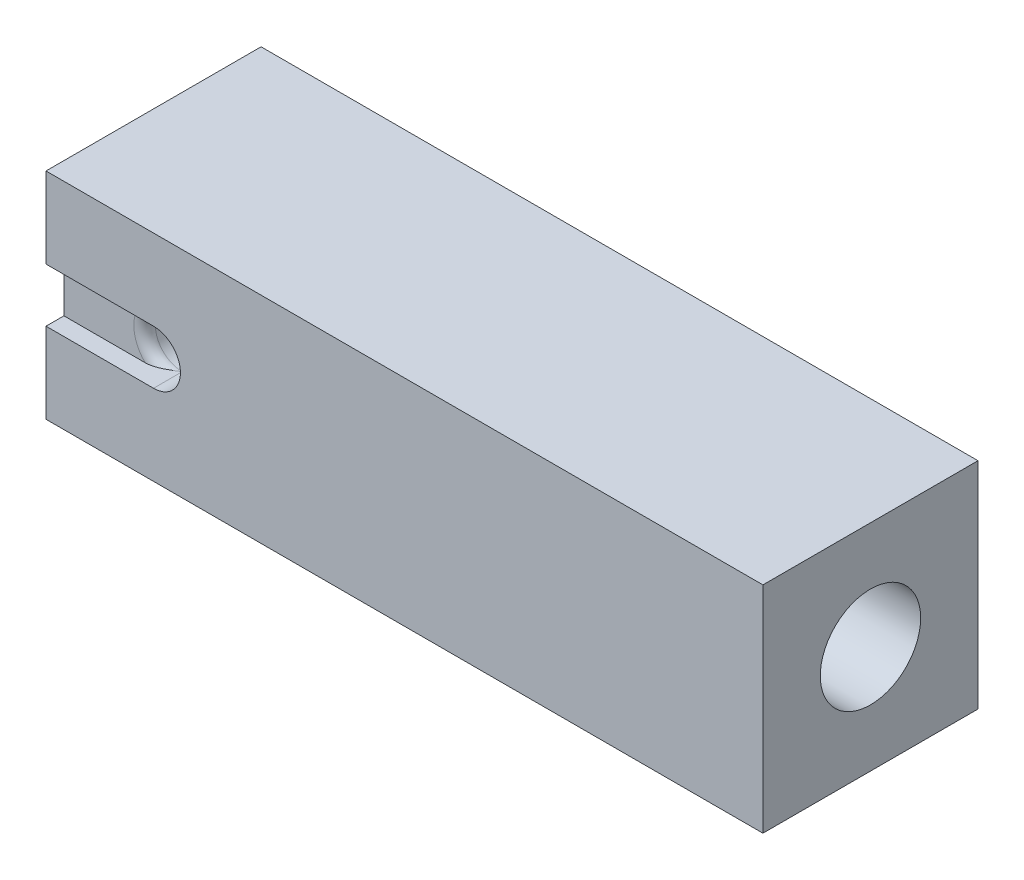
ISO-10303-21;
HEADER;
FILE_DESCRIPTION(('STEP AP214'),'2;1');
FILE_NAME('part.step','',(''),(''),'','','');
FILE_SCHEMA(('AUTOMOTIVE_DESIGN { 1 0 10303 214 1 1 1 1 }'));
ENDSEC;
DATA;
#1=APPLICATION_CONTEXT('core data for automotive mechanical design processes');
#2=APPLICATION_PROTOCOL_DEFINITION('international standard','automotive_design',2000,#1);
#3=PRODUCT_CONTEXT('',#1,'mechanical');
#4=PRODUCT('Part','Part','',(#3));
#5=PRODUCT_RELATED_PRODUCT_CATEGORY('part','',(#4));
#6=PRODUCT_DEFINITION_FORMATION('','',#4);
#7=PRODUCT_DEFINITION_CONTEXT('part definition',#1,'design');
#8=PRODUCT_DEFINITION('design','',#6,#7);
#9=PRODUCT_DEFINITION_SHAPE('','',#8);
#10=(LENGTH_UNIT() NAMED_UNIT(*) SI_UNIT(.MILLI.,.METRE.));
#11=(NAMED_UNIT(*) PLANE_ANGLE_UNIT() SI_UNIT($,.RADIAN.));
#12=(NAMED_UNIT(*) SI_UNIT($,.STERADIAN.) SOLID_ANGLE_UNIT());
#13=UNCERTAINTY_MEASURE_WITH_UNIT(LENGTH_MEASURE(1.E-05),#10,'distance_accuracy_value','');
#14=(GEOMETRIC_REPRESENTATION_CONTEXT(3) GLOBAL_UNCERTAINTY_ASSIGNED_CONTEXT((#13)) GLOBAL_UNIT_ASSIGNED_CONTEXT((#10,
#11,#12)) REPRESENTATION_CONTEXT('',''));
#15=CARTESIAN_POINT('',(0.,0.,0.));
#16=DIRECTION('',(0.,0.,1.));
#17=DIRECTION('',(1.,0.,0.));
#18=AXIS2_PLACEMENT_3D('',#15,#16,#17);
#19=CARTESIAN_POINT('',(-10.,6.,-6.));
#20=DIRECTION('',(1.,0.,0.));
#21=DIRECTION('',(0.,0.,-1.));
#22=AXIS2_PLACEMENT_3D('',#19,#20,#21);
#23=PLANE('',#22);
#24=DIRECTION('',(0.,0.,1.));
#25=VECTOR('',#24,1.);
#26=CARTESIAN_POINT('',(-10.,2.25,-0.500000000000004));
#27=LINE('',#26,#25);
#28=CARTESIAN_POINT('',(-10.,2.25,-0.500000000000004));
#29=VERTEX_POINT('',#28);
#30=CARTESIAN_POINT('',(-10.,2.25,0.));
#31=VERTEX_POINT('',#30);
#32=EDGE_CURVE('E158',#29,#31,#27,.T.);
#33=ORIENTED_EDGE('',*,*,#32,.F.);
#34=DIRECTION('',(0.,1.,0.));
#35=VECTOR('',#34,1.);
#36=CARTESIAN_POINT('',(-10.,3.75,-0.500000000000004));
#37=LINE('',#36,#35);
#38=CARTESIAN_POINT('',(-10.,3.75,-0.500000000000004));
#39=VERTEX_POINT('',#38);
#40=EDGE_CURVE('E165',#29,#39,#37,.T.);
#41=ORIENTED_EDGE('',*,*,#40,.T.);
#42=DIRECTION('',(0.,0.,1.));
#43=VECTOR('',#42,1.);
#44=CARTESIAN_POINT('',(-10.,3.75,-0.500000000000004));
#45=LINE('',#44,#43);
#46=CARTESIAN_POINT('',(-10.,3.75,0.));
#47=VERTEX_POINT('',#46);
#48=EDGE_CURVE('E146',#39,#47,#45,.T.);
#49=ORIENTED_EDGE('',*,*,#48,.T.);
#50=DIRECTION('',(0.,-1.,0.));
#51=VECTOR('',#50,1.);
#52=CARTESIAN_POINT('',(-10.,6.,0.));
#53=LINE('',#52,#51);
#54=CARTESIAN_POINT('',(-10.,6.,0.));
#55=VERTEX_POINT('',#54);
#56=EDGE_CURVE('E246',#55,#47,#53,.T.);
#57=ORIENTED_EDGE('',*,*,#56,.F.);
#58=DIRECTION('',(0.,0.,1.));
#59=VECTOR('',#58,1.);
#60=CARTESIAN_POINT('',(-10.,6.,-6.));
#61=LINE('',#60,#59);
#62=CARTESIAN_POINT('',(-10.,6.,-6.));
#63=VERTEX_POINT('',#62);
#64=EDGE_CURVE('E217',#63,#55,#61,.T.);
#65=ORIENTED_EDGE('',*,*,#64,.F.);
#66=DIRECTION('',(0.,-1.,0.));
#67=VECTOR('',#66,1.);
#68=CARTESIAN_POINT('',(-10.,6.,-6.));
#69=LINE('',#68,#67);
#70=CARTESIAN_POINT('',(-10.,3.75,-6.));
#71=VERTEX_POINT('',#70);
#72=EDGE_CURVE('E236',#63,#71,#69,.T.);
#73=ORIENTED_EDGE('',*,*,#72,.T.);
#74=DIRECTION('',(0.,0.,-1.));
#75=VECTOR('',#74,1.);
#76=CARTESIAN_POINT('',(-10.,3.75,-5.5));
#77=LINE('',#76,#75);
#78=CARTESIAN_POINT('',(-10.,3.75,-5.5));
#79=VERTEX_POINT('',#78);
#80=EDGE_CURVE('E199',#79,#71,#77,.T.);
#81=ORIENTED_EDGE('',*,*,#80,.F.);
#82=DIRECTION('',(0.,1.,0.));
#83=VECTOR('',#82,1.);
#84=CARTESIAN_POINT('',(-10.,3.75,-5.5));
#85=LINE('',#84,#83);
#86=CARTESIAN_POINT('',(-10.,2.25,-5.5));
#87=VERTEX_POINT('',#86);
#88=EDGE_CURVE('E187',#87,#79,#85,.T.);
#89=ORIENTED_EDGE('',*,*,#88,.F.);
#90=DIRECTION('',(0.,0.,-1.));
#91=VECTOR('',#90,1.);
#92=CARTESIAN_POINT('',(-10.,2.25,-5.5));
#93=LINE('',#92,#91);
#94=CARTESIAN_POINT('',(-10.,2.25,-6.));
#95=VERTEX_POINT('',#94);
#96=EDGE_CURVE('E201',#87,#95,#93,.T.);
#97=ORIENTED_EDGE('',*,*,#96,.T.);
#98=CARTESIAN_POINT('',(-10.,0.,-6.));
#99=VERTEX_POINT('',#98);
#100=EDGE_CURVE('E227',#95,#99,#69,.T.);
#101=ORIENTED_EDGE('',*,*,#100,.T.);
#102=DIRECTION('',(0.,0.,1.));
#103=VECTOR('',#102,1.);
#104=CARTESIAN_POINT('',(-10.,0.,-6.));
#105=LINE('',#104,#103);
#106=CARTESIAN_POINT('',(-10.,0.,0.));
#107=VERTEX_POINT('',#106);
#108=EDGE_CURVE('E214',#99,#107,#105,.T.);
#109=ORIENTED_EDGE('',*,*,#108,.T.);
#110=EDGE_CURVE('E245',#31,#107,#53,.T.);
#111=ORIENTED_EDGE('',*,*,#110,.F.);
#112=EDGE_LOOP('',(#33,#41,#49,#57,#65,#73,#81,#89,#97,#101,#109,#111));
#113=FACE_BOUND('',#112,.T.);
#114=ADVANCED_FACE('F39',(#113),#23,.F.);
#115=CARTESIAN_POINT('',(-10.,6.,0.));
#116=DIRECTION('',(0.,0.,-1.));
#117=DIRECTION('',(-1.,0.,0.));
#118=AXIS2_PLACEMENT_3D('',#115,#116,#117);
#119=PLANE('',#118);
#120=DIRECTION('',(-1.,0.,0.));
#121=VECTOR('',#120,1.);
#122=CARTESIAN_POINT('',(-10.,2.25,0.));
#123=LINE('',#122,#121);
#124=CARTESIAN_POINT('',(-7.,2.25,0.));
#125=VERTEX_POINT('',#124);
#126=EDGE_CURVE('E169',#125,#31,#123,.T.);
#127=ORIENTED_EDGE('',*,*,#126,.T.);
#128=ORIENTED_EDGE('',*,*,#110,.T.);
#129=DIRECTION('',(1.,0.,0.));
#130=VECTOR('',#129,1.);
#131=CARTESIAN_POINT('',(-10.,0.,0.));
#132=LINE('',#131,#130);
#133=CARTESIAN_POINT('',(10.,0.,0.));
#134=VERTEX_POINT('',#133);
#135=EDGE_CURVE('E230',#107,#134,#132,.T.);
#136=ORIENTED_EDGE('',*,*,#135,.T.);
#137=DIRECTION('',(0.,-1.,0.));
#138=VECTOR('',#137,1.);
#139=CARTESIAN_POINT('',(10.,6.,0.));
#140=LINE('',#139,#138);
#141=CARTESIAN_POINT('',(10.,6.,0.));
#142=VERTEX_POINT('',#141);
#143=EDGE_CURVE('E242',#142,#134,#140,.T.);
#144=ORIENTED_EDGE('',*,*,#143,.F.);
#145=DIRECTION('',(1.,0.,0.));
#146=VECTOR('',#145,1.);
#147=CARTESIAN_POINT('',(-10.,6.,0.));
#148=LINE('',#147,#146);
#149=EDGE_CURVE('E220',#55,#142,#148,.T.);
#150=ORIENTED_EDGE('',*,*,#149,.F.);
#151=ORIENTED_EDGE('',*,*,#56,.T.);
#152=DIRECTION('',(1.,0.,0.));
#153=VECTOR('',#152,1.);
#154=CARTESIAN_POINT('',(-7.,3.75,0.));
#155=LINE('',#154,#153);
#156=CARTESIAN_POINT('',(-7.,3.75,0.));
#157=VERTEX_POINT('',#156);
#158=EDGE_CURVE('E153',#47,#157,#155,.T.);
#159=ORIENTED_EDGE('',*,*,#158,.T.);
#160=CARTESIAN_POINT('',(-7.,3.,0.));
#161=DIRECTION('',(0.,0.,-1.));
#162=DIRECTION('',(-1.,0.,0.));
#163=AXIS2_PLACEMENT_3D('',#160,#161,#162);
#164=CIRCLE('',#163,0.749999999999999);
#165=EDGE_CURVE('E207',#125,#157,#164,.F.);
#166=ORIENTED_EDGE('',*,*,#165,.F.);
#167=EDGE_LOOP('',(#127,#128,#136,#144,#150,#151,#159,#166));
#168=FACE_BOUND('',#167,.T.);
#169=ADVANCED_FACE('F280',(#168),#119,.F.);
#170=CARTESIAN_POINT('',(-7.,3.,2.12132034355964));
#171=DIRECTION('',(0.,0.,-1.));
#172=DIRECTION('',(-1.,0.,0.));
#173=AXIS2_PLACEMENT_3D('',#170,#171,#172);
#174=CYLINDRICAL_SURFACE('',#173,0.749999999999999);
#175=CARTESIAN_POINT('',(-7.,3.,-0.800000000000005));
#176=DIRECTION('',(0.,0.,-1.));
#177=DIRECTION('',(-1.,0.,0.));
#178=AXIS2_PLACEMENT_3D('',#175,#176,#177);
#179=CIRCLE('',#178,0.749999999999999);
#180=CARTESIAN_POINT('',(-7.,3.75,-0.800000000000005));
#181=VERTEX_POINT('',#180);
#182=CARTESIAN_POINT('',(-7.,2.25,-0.800000000000005));
#183=VERTEX_POINT('',#182);
#184=EDGE_CURVE('E251',#181,#183,#179,.F.);
#185=ORIENTED_EDGE('',*,*,#184,.T.);
#186=DIRECTION('',(0.,0.,1.));
#187=VECTOR('',#186,1.);
#188=CARTESIAN_POINT('',(-7.,2.25,-0.500000000000004));
#189=LINE('',#188,#187);
#190=EDGE_CURVE('E179',#183,#125,#189,.T.);
#191=ORIENTED_EDGE('',*,*,#190,.T.);
#192=ORIENTED_EDGE('',*,*,#165,.T.);
#193=DIRECTION('',(0.,0.,1.));
#194=VECTOR('',#193,1.);
#195=CARTESIAN_POINT('',(-7.,3.75,-0.500000000000004));
#196=LINE('',#195,#194);
#197=EDGE_CURVE('E159',#181,#157,#196,.T.);
#198=ORIENTED_EDGE('',*,*,#197,.F.);
#199=EDGE_LOOP('',(#185,#191,#192,#198));
#200=FACE_BOUND('',#199,.T.);
#201=CARTESIAN_POINT('',(-7.,3.,-5.2));
#202=DIRECTION('',(0.,0.,1.));
#203=DIRECTION('',(1.,0.,0.));
#204=AXIS2_PLACEMENT_3D('',#201,#202,#203);
#205=CIRCLE('',#204,0.749999999999999);
#206=CARTESIAN_POINT('',(-7.,2.25,-5.2));
#207=VERTEX_POINT('',#206);
#208=CARTESIAN_POINT('',(-7.,3.75,-5.2));
#209=VERTEX_POINT('',#208);
#210=EDGE_CURVE('E248',#207,#209,#205,.F.);
#211=ORIENTED_EDGE('',*,*,#210,.T.);
#212=DIRECTION('',(0.,0.,-1.));
#213=VECTOR('',#212,1.);
#214=CARTESIAN_POINT('',(-7.,3.75,-5.5));
#215=LINE('',#214,#213);
#216=CARTESIAN_POINT('',(-7.,3.75,-6.));
#217=VERTEX_POINT('',#216);
#218=EDGE_CURVE('E195',#209,#217,#215,.T.);
#219=ORIENTED_EDGE('',*,*,#218,.T.);
#220=CARTESIAN_POINT('',(-7.,3.,-6.));
#221=DIRECTION('',(0.,0.,-1.));
#222=DIRECTION('',(-1.,0.,0.));
#223=AXIS2_PLACEMENT_3D('',#220,#221,#222);
#224=CIRCLE('',#223,0.749999999999999);
#225=CARTESIAN_POINT('',(-7.,2.25,-6.));
#226=VERTEX_POINT('',#225);
#227=EDGE_CURVE('E198',#217,#226,#224,.T.);
#228=ORIENTED_EDGE('',*,*,#227,.T.);
#229=DIRECTION('',(0.,0.,-1.));
#230=VECTOR('',#229,1.);
#231=CARTESIAN_POINT('',(-7.,2.25,-5.5));
#232=LINE('',#231,#230);
#233=EDGE_CURVE('E192',#207,#226,#232,.T.);
#234=ORIENTED_EDGE('',*,*,#233,.F.);
#235=EDGE_LOOP('',(#211,#219,#228,#234));
#236=FACE_BOUND('',#235,.T.);
#237=ADVANCED_FACE('F283',(#200,#236),#174,.F.);
#238=CARTESIAN_POINT('',(10.,6.,-6.));
#239=DIRECTION('',(-1.,0.,0.));
#240=DIRECTION('',(0.,0.,1.));
#241=AXIS2_PLACEMENT_3D('',#238,#239,#240);
#242=PLANE('',#241);
#243=CARTESIAN_POINT('',(10.,3.,-3.));
#244=DIRECTION('',(1.,0.,0.));
#245=DIRECTION('',(0.,0.,-1.));
#246=AXIS2_PLACEMENT_3D('',#243,#244,#245);
#247=CIRCLE('',#246,1.4);
#248=CARTESIAN_POINT('',(10.,3.,-4.4));
#249=VERTEX_POINT('',#248);
#250=EDGE_CURVE('E210',#249,#249,#247,.T.);
#251=ORIENTED_EDGE('',*,*,#250,.F.);
#252=EDGE_LOOP('',(#251));
#253=FACE_BOUND('',#252,.T.);
#254=DIRECTION('',(0.,0.,-1.));
#255=VECTOR('',#254,1.);
#256=CARTESIAN_POINT('',(10.,0.,-6.));
#257=LINE('',#256,#255);
#258=CARTESIAN_POINT('',(10.,0.,-6.));
#259=VERTEX_POINT('',#258);
#260=EDGE_CURVE('E232',#134,#259,#257,.T.);
#261=ORIENTED_EDGE('',*,*,#260,.T.);
#262=DIRECTION('',(0.,-1.,0.));
#263=VECTOR('',#262,1.);
#264=CARTESIAN_POINT('',(10.,6.,-6.));
#265=LINE('',#264,#263);
#266=CARTESIAN_POINT('',(10.,6.,-6.));
#267=VERTEX_POINT('',#266);
#268=EDGE_CURVE('E239',#267,#259,#265,.T.);
#269=ORIENTED_EDGE('',*,*,#268,.F.);
#270=DIRECTION('',(0.,0.,-1.));
#271=VECTOR('',#270,1.);
#272=CARTESIAN_POINT('',(10.,6.,-6.));
#273=LINE('',#272,#271);
#274=EDGE_CURVE('E223',#142,#267,#273,.T.);
#275=ORIENTED_EDGE('',*,*,#274,.F.);
#276=ORIENTED_EDGE('',*,*,#143,.T.);
#277=EDGE_LOOP('',(#261,#269,#275,#276));
#278=FACE_BOUND('',#277,.T.);
#279=ADVANCED_FACE('F285',(#253,#278),#242,.F.);
#280=CARTESIAN_POINT('',(-10.,6.,-6.));
#281=DIRECTION('',(0.,0.,1.));
#282=DIRECTION('',(1.,0.,0.));
#283=AXIS2_PLACEMENT_3D('',#280,#281,#282);
#284=PLANE('',#283);
#285=ORIENTED_EDGE('',*,*,#227,.F.);
#286=DIRECTION('',(1.,0.,0.));
#287=VECTOR('',#286,1.);
#288=CARTESIAN_POINT('',(-7.,3.75,-6.));
#289=LINE('',#288,#287);
#290=EDGE_CURVE('E188',#71,#217,#289,.T.);
#291=ORIENTED_EDGE('',*,*,#290,.F.);
#292=ORIENTED_EDGE('',*,*,#72,.F.);
#293=DIRECTION('',(-1.,0.,0.));
#294=VECTOR('',#293,1.);
#295=CARTESIAN_POINT('',(-10.,6.,-6.));
#296=LINE('',#295,#294);
#297=EDGE_CURVE('E225',#267,#63,#296,.T.);
#298=ORIENTED_EDGE('',*,*,#297,.F.);
#299=ORIENTED_EDGE('',*,*,#268,.T.);
#300=DIRECTION('',(-1.,0.,0.));
#301=VECTOR('',#300,1.);
#302=CARTESIAN_POINT('',(-10.,0.,-6.));
#303=LINE('',#302,#301);
#304=EDGE_CURVE('E221',#259,#99,#303,.T.);
#305=ORIENTED_EDGE('',*,*,#304,.T.);
#306=ORIENTED_EDGE('',*,*,#100,.F.);
#307=DIRECTION('',(-1.,0.,0.));
#308=VECTOR('',#307,1.);
#309=CARTESIAN_POINT('',(-10.,2.25,-6.));
#310=LINE('',#309,#308);
#311=EDGE_CURVE('E182',#226,#95,#310,.T.);
#312=ORIENTED_EDGE('',*,*,#311,.F.);
#313=EDGE_LOOP('',(#285,#291,#292,#298,#299,#305,#306,#312));
#314=FACE_BOUND('',#313,.T.);
#315=ADVANCED_FACE('F288',(#314),#284,.F.);
#316=CARTESIAN_POINT('',(0.,6.,0.));
#317=DIRECTION('',(0.,1.,0.));
#318=DIRECTION('',(0.,0.,1.));
#319=AXIS2_PLACEMENT_3D('',#316,#317,#318);
#320=PLANE('',#319);
#321=ORIENTED_EDGE('',*,*,#64,.T.);
#322=ORIENTED_EDGE('',*,*,#149,.T.);
#323=ORIENTED_EDGE('',*,*,#274,.T.);
#324=ORIENTED_EDGE('',*,*,#297,.T.);
#325=EDGE_LOOP('',(#321,#322,#323,#324));
#326=FACE_BOUND('',#325,.T.);
#327=ADVANCED_FACE('F292',(#326),#320,.T.);
#328=CARTESIAN_POINT('',(0.,0.,0.));
#329=DIRECTION('',(0.,1.,0.));
#330=DIRECTION('',(0.,0.,1.));
#331=AXIS2_PLACEMENT_3D('',#328,#329,#330);
#332=PLANE('',#331);
#333=ORIENTED_EDGE('',*,*,#108,.F.);
#334=ORIENTED_EDGE('',*,*,#304,.F.);
#335=ORIENTED_EDGE('',*,*,#260,.F.);
#336=ORIENTED_EDGE('',*,*,#135,.F.);
#337=EDGE_LOOP('',(#333,#334,#335,#336));
#338=FACE_BOUND('',#337,.T.);
#339=ADVANCED_FACE('F294',(#338),#332,.F.);
#340=CARTESIAN_POINT('',(-5.,3.,-2.99999999999999));
#341=DIRECTION('',(1.,0.,0.));
#342=DIRECTION('',(0.,0.,-1.));
#343=AXIS2_PLACEMENT_3D('',#340,#341,#342);
#344=CYLINDRICAL_SURFACE('',#343,1.4);
#345=CARTESIAN_POINT('',(-5.,3.,-2.99999999999999));
#346=DIRECTION('',(1.,0.,0.));
#347=DIRECTION('',(0.,0.,-1.));
#348=AXIS2_PLACEMENT_3D('',#345,#346,#347);
#349=CIRCLE('',#348,1.4);
#350=CARTESIAN_POINT('',(-5.,3.,-4.39999999999999));
#351=VERTEX_POINT('',#350);
#352=EDGE_CURVE('E211',#351,#351,#349,.T.);
#353=ORIENTED_EDGE('',*,*,#352,.F.);
#354=EDGE_LOOP('',(#353));
#355=FACE_BOUND('',#354,.T.);
#356=ORIENTED_EDGE('',*,*,#250,.T.);
#357=EDGE_LOOP('',(#356));
#358=FACE_BOUND('',#357,.T.);
#359=ADVANCED_FACE('F297',(#355,#358),#344,.F.);
#360=CARTESIAN_POINT('',(-5.,3.,-2.99999999999999));
#361=DIRECTION('',(1.,0.,0.));
#362=DIRECTION('',(0.,0.,-1.));
#363=AXIS2_PLACEMENT_3D('',#360,#361,#362);
#364=PLANE('',#363);
#365=ORIENTED_EDGE('',*,*,#352,.T.);
#366=EDGE_LOOP('',(#365));
#367=FACE_BOUND('',#366,.T.);
#368=ADVANCED_FACE('F304',(#367),#364,.T.);
#369=CARTESIAN_POINT('',(0.,0.,-5.5));
#370=DIRECTION('',(0.,0.,1.));
#371=DIRECTION('',(1.,0.,0.));
#372=AXIS2_PLACEMENT_3D('',#369,#370,#371);
#373=PLANE('',#372);
#374=DIRECTION('',(1.,0.,0.));
#375=VECTOR('',#374,1.);
#376=CARTESIAN_POINT('',(-7.,3.75,-5.5));
#377=LINE('',#376,#375);
#378=CARTESIAN_POINT('',(-7.73484692283495,3.75,-5.5));
#379=VERTEX_POINT('',#378);
#380=EDGE_CURVE('E190',#79,#379,#377,.T.);
#381=ORIENTED_EDGE('',*,*,#380,.T.);
#382=CARTESIAN_POINT('',(-7.,3.,-5.5));
#383=DIRECTION('',(0.,0.,1.));
#384=DIRECTION('',(1.,0.,0.));
#385=AXIS2_PLACEMENT_3D('',#382,#383,#384);
#386=CIRCLE('',#385,1.05);
#387=CARTESIAN_POINT('',(-7.73484692283495,2.25,-5.5));
#388=VERTEX_POINT('',#387);
#389=EDGE_CURVE('E66',#379,#388,#386,.T.);
#390=ORIENTED_EDGE('',*,*,#389,.T.);
#391=DIRECTION('',(-1.,0.,0.));
#392=VECTOR('',#391,1.);
#393=CARTESIAN_POINT('',(-10.,2.25,-5.5));
#394=LINE('',#393,#392);
#395=EDGE_CURVE('E185',#388,#87,#394,.T.);
#396=ORIENTED_EDGE('',*,*,#395,.T.);
#397=ORIENTED_EDGE('',*,*,#88,.T.);
#398=EDGE_LOOP('',(#381,#390,#396,#397));
#399=FACE_BOUND('',#398,.T.);
#400=ADVANCED_FACE('F308',(#399),#373,.F.);
#401=CARTESIAN_POINT('',(-7.,3.75,-5.5));
#402=DIRECTION('',(0.,1.,0.));
#403=DIRECTION('',(0.,0.,1.));
#404=AXIS2_PLACEMENT_3D('',#401,#402,#403);
#405=PLANE('',#404);
#406=ORIENTED_EDGE('',*,*,#290,.T.);
#407=ORIENTED_EDGE('',*,*,#218,.F.);
#408=CARTESIAN_POINT('',(-7.73484692283495,3.75,-5.5));
#409=CARTESIAN_POINT('',(-7.71457963833843,3.75,-5.49999650216064));
#410=CARTESIAN_POINT('',(-7.69433837118223,3.75,-5.49899494252242));
#411=CARTESIAN_POINT('',(-7.65405899117544,3.75,-5.49523256069494));
#412=CARTESIAN_POINT('',(-7.63402054474166,3.75,-5.49247538130379));
#413=CARTESIAN_POINT('',(-7.574957149077,3.75,-5.48203183628809));
#414=CARTESIAN_POINT('',(-7.5363191073463,3.75,-5.47215734231254));
#415=CARTESIAN_POINT('',(-7.45427573150194,3.75,-5.44606176530555));
#416=CARTESIAN_POINT('',(-7.41112892045772,3.75,-5.4290649744382));
#417=CARTESIAN_POINT('',(-7.32662757421576,3.75,-5.39103406159057));
#418=CARTESIAN_POINT('',(-7.28527601314829,3.75,-5.36999353157778));
#419=CARTESIAN_POINT('',(-7.16268491709513,3.75,-5.30280669260891));
#420=CARTESIAN_POINT('',(-7.08359403156131,3.75,-5.2528679010496));
#421=CARTESIAN_POINT('',(-7.00308604036269,3.75,-5.20195176495855));
#422=CARTESIAN_POINT('',(-7.00154300629214,3.75,-5.20097586399109));
#423=CARTESIAN_POINT('',(-7.,3.75,-5.2));
#424=B_SPLINE_CURVE_WITH_KNOTS('',3,(#408,#409,#410,#411,#412,#413,#414,#415,#416,#417,#418,
#419,#420,#421,#422,#423),.UNSPECIFIED.,.F.,.F.,(4,2,2,2,2,2,2,4),(0.,0.0607377981232434,
0.121349978085521,0.240602101656487,0.379428911287212,0.518477558507693,0.798766337681518,
0.804243563259194),.UNSPECIFIED.);
#425=EDGE_CURVE('E53',#209,#379,#424,.F.);
#426=ORIENTED_EDGE('',*,*,#425,.T.);
#427=ORIENTED_EDGE('',*,*,#380,.F.);
#428=ORIENTED_EDGE('',*,*,#80,.T.);
#429=EDGE_LOOP('',(#406,#407,#426,#427,#428));
#430=FACE_BOUND('',#429,.T.);
#431=ADVANCED_FACE('F316',(#430),#405,.F.);
#432=CARTESIAN_POINT('',(-10.,2.25,-5.5));
#433=DIRECTION('',(0.,-1.,0.));
#434=DIRECTION('',(1.,0.,0.));
#435=AXIS2_PLACEMENT_3D('',#432,#433,#434);
#436=PLANE('',#435);
#437=ORIENTED_EDGE('',*,*,#311,.T.);
#438=ORIENTED_EDGE('',*,*,#96,.F.);
#439=ORIENTED_EDGE('',*,*,#395,.F.);
#440=CARTESIAN_POINT('',(-7.73484692283495,2.25,-5.5));
#441=CARTESIAN_POINT('',(-7.71457963833843,2.25,-5.49999650216064));
#442=CARTESIAN_POINT('',(-7.69433837118223,2.25,-5.49899494252242));
#443=CARTESIAN_POINT('',(-7.65405899117544,2.25,-5.49523256069494));
#444=CARTESIAN_POINT('',(-7.63402054474166,2.25,-5.49247538130379));
#445=CARTESIAN_POINT('',(-7.574957149077,2.25,-5.48203183628809));
#446=CARTESIAN_POINT('',(-7.5363191073463,2.25,-5.47215734231254));
#447=CARTESIAN_POINT('',(-7.45427573150194,2.25,-5.44606176530555));
#448=CARTESIAN_POINT('',(-7.41112892045772,2.25,-5.4290649744382));
#449=CARTESIAN_POINT('',(-7.32662757421576,2.25,-5.39103406159057));
#450=CARTESIAN_POINT('',(-7.28527601314829,2.25,-5.36999353157778));
#451=CARTESIAN_POINT('',(-7.16268491709513,2.25,-5.30280669260891));
#452=CARTESIAN_POINT('',(-7.08359403156131,2.25,-5.2528679010496));
#453=CARTESIAN_POINT('',(-7.00308604036269,2.25,-5.20195176495855));
#454=CARTESIAN_POINT('',(-7.00154300629214,2.25,-5.20097586399109));
#455=CARTESIAN_POINT('',(-7.,2.25,-5.2));
#456=B_SPLINE_CURVE_WITH_KNOTS('',3,(#440,#441,#442,#443,#444,#445,#446,#447,#448,#449,#450,
#451,#452,#453,#454,#455),.UNSPECIFIED.,.F.,.F.,(4,2,2,2,2,2,2,4),(0.,0.0607377981232434,
0.121349978085521,0.240602101656487,0.379428911287212,0.518477558507693,0.798766337681518,
0.804243563259194),.UNSPECIFIED.);
#457=EDGE_CURVE('E11',#388,#207,#456,.T.);
#458=ORIENTED_EDGE('',*,*,#457,.T.);
#459=ORIENTED_EDGE('',*,*,#233,.T.);
#460=EDGE_LOOP('',(#437,#438,#439,#458,#459));
#461=FACE_BOUND('',#460,.T.);
#462=ADVANCED_FACE('F312',(#461),#436,.F.);
#463=CARTESIAN_POINT('',(0.,0.,-0.500000000000005));
#464=DIRECTION('',(0.,0.,-1.));
#465=DIRECTION('',(1.,0.,0.));
#466=AXIS2_PLACEMENT_3D('',#463,#464,#465);
#467=PLANE('',#466);
#468=DIRECTION('',(-1.,0.,0.));
#469=VECTOR('',#468,1.);
#470=CARTESIAN_POINT('',(-10.,2.25,-0.500000000000004));
#471=LINE('',#470,#469);
#472=CARTESIAN_POINT('',(-7.73484692283495,2.25,-0.500000000000005));
#473=VERTEX_POINT('',#472);
#474=EDGE_CURVE('E172',#473,#29,#471,.T.);
#475=ORIENTED_EDGE('',*,*,#474,.F.);
#476=CARTESIAN_POINT('',(-7.,3.,-0.500000000000005));
#477=DIRECTION('',(0.,0.,-1.));
#478=DIRECTION('',(-1.,0.,0.));
#479=AXIS2_PLACEMENT_3D('',#476,#477,#478);
#480=CIRCLE('',#479,1.05);
#481=CARTESIAN_POINT('',(-7.73484692283495,3.75,-0.500000000000004));
#482=VERTEX_POINT('',#481);
#483=EDGE_CURVE('E168',#473,#482,#480,.T.);
#484=ORIENTED_EDGE('',*,*,#483,.T.);
#485=DIRECTION('',(1.,0.,0.));
#486=VECTOR('',#485,1.);
#487=CARTESIAN_POINT('',(-7.,3.75,-0.500000000000004));
#488=LINE('',#487,#486);
#489=EDGE_CURVE('E150',#39,#482,#488,.T.);
#490=ORIENTED_EDGE('',*,*,#489,.F.);
#491=ORIENTED_EDGE('',*,*,#40,.F.);
#492=EDGE_LOOP('',(#475,#484,#490,#491));
#493=FACE_BOUND('',#492,.T.);
#494=ADVANCED_FACE('F164',(#493),#467,.F.);
#495=CARTESIAN_POINT('',(-10.,2.25,-0.500000000000004));
#496=DIRECTION('',(0.,1.,0.));
#497=DIRECTION('',(-1.,0.,0.));
#498=AXIS2_PLACEMENT_3D('',#495,#496,#497);
#499=PLANE('',#498);
#500=ORIENTED_EDGE('',*,*,#126,.F.);
#501=ORIENTED_EDGE('',*,*,#190,.F.);
#502=CARTESIAN_POINT('',(-7.73484692283495,2.25,-0.500000000000005));
#503=CARTESIAN_POINT('',(-7.71457963833843,2.25,-0.500003497839362));
#504=CARTESIAN_POINT('',(-7.69433837118223,2.25,-0.501005057477591));
#505=CARTESIAN_POINT('',(-7.65405899117544,2.25,-0.50476743930507));
#506=CARTESIAN_POINT('',(-7.63402054474166,2.25,-0.507524618696222));
#507=CARTESIAN_POINT('',(-7.574957149077,2.25,-0.51796816371192));
#508=CARTESIAN_POINT('',(-7.5363191073463,2.25,-0.527842657687463));
#509=CARTESIAN_POINT('',(-7.45427573150194,2.25,-0.553938234694462));
#510=CARTESIAN_POINT('',(-7.41112892045772,2.25,-0.570935025561811));
#511=CARTESIAN_POINT('',(-7.32662757421576,2.25,-0.608965938409442));
#512=CARTESIAN_POINT('',(-7.28527601314829,2.25,-0.63000646842223));
#513=CARTESIAN_POINT('',(-7.16268491709513,2.25,-0.697193307391087));
#514=CARTESIAN_POINT('',(-7.08359403156129,2.25,-0.747132098950374));
#515=CARTESIAN_POINT('',(-7.00308604036269,2.25,-0.79804823504146));
#516=CARTESIAN_POINT('',(-7.00154300629214,2.25,-0.799024136008914));
#517=CARTESIAN_POINT('',(-7.,2.25,-0.800000000000005));
#518=B_SPLINE_CURVE_WITH_KNOTS('',3,(#502,#503,#504,#505,#506,#507,#508,#509,#510,#511,#512,
#513,#514,#515,#516,#517),.UNSPECIFIED.,.F.,.F.,(4,2,2,2,2,2,2,4),(0.,0.0607377981232425,
0.121349978085517,0.240602101656488,0.379428911287212,0.518477558507695,0.798766337681517,
0.804243563259194),.UNSPECIFIED.);
#519=EDGE_CURVE('E256',#183,#473,#518,.F.);
#520=ORIENTED_EDGE('',*,*,#519,.T.);
#521=ORIENTED_EDGE('',*,*,#474,.T.);
#522=ORIENTED_EDGE('',*,*,#32,.T.);
#523=EDGE_LOOP('',(#500,#501,#520,#521,#522));
#524=FACE_BOUND('',#523,.T.);
#525=ADVANCED_FACE('F269',(#524),#499,.T.);
#526=CARTESIAN_POINT('',(-7.,3.75,-0.500000000000004));
#527=DIRECTION('',(0.,-1.,0.));
#528=DIRECTION('',(0.,0.,-1.));
#529=AXIS2_PLACEMENT_3D('',#526,#527,#528);
#530=PLANE('',#529);
#531=ORIENTED_EDGE('',*,*,#158,.F.);
#532=ORIENTED_EDGE('',*,*,#48,.F.);
#533=ORIENTED_EDGE('',*,*,#489,.T.);
#534=CARTESIAN_POINT('',(-7.73484692283495,3.75,-0.500000000000005));
#535=CARTESIAN_POINT('',(-7.71457963833843,3.75,-0.500003497839362));
#536=CARTESIAN_POINT('',(-7.69433837118223,3.75,-0.501005057477591));
#537=CARTESIAN_POINT('',(-7.65405899117544,3.75,-0.504767439305071));
#538=CARTESIAN_POINT('',(-7.63402054474166,3.75,-0.507524618696222));
#539=CARTESIAN_POINT('',(-7.574957149077,3.75,-0.517968163711921));
#540=CARTESIAN_POINT('',(-7.5363191073463,3.75,-0.527842657687463));
#541=CARTESIAN_POINT('',(-7.45427573150194,3.75,-0.553938234694462));
#542=CARTESIAN_POINT('',(-7.41112892045772,3.75,-0.570935025561812));
#543=CARTESIAN_POINT('',(-7.32662757421576,3.75,-0.60896593840944));
#544=CARTESIAN_POINT('',(-7.28527601314829,3.75,-0.630006468422222));
#545=CARTESIAN_POINT('',(-7.16268491709513,3.75,-0.697193307391099));
#546=CARTESIAN_POINT('',(-7.08359403156133,3.75,-0.747132098950442));
#547=CARTESIAN_POINT('',(-7.00308604036269,3.75,-0.798048235041463));
#548=CARTESIAN_POINT('',(-7.00154300629215,3.75,-0.799024136008915));
#549=CARTESIAN_POINT('',(-7.,3.75,-0.800000000000005));
#550=B_SPLINE_CURVE_WITH_KNOTS('',3,(#534,#535,#536,#537,#538,#539,#540,#541,#542,#543,#544,
#545,#546,#547,#548,#549),.UNSPECIFIED.,.F.,.F.,(4,2,2,2,2,2,2,4),(0.,0.0607377981232452,
0.121349978085525,0.240602101656488,0.379428911287212,0.518477558507692,0.798766337681518,
0.804243563259194),.UNSPECIFIED.);
#551=EDGE_CURVE('E263',#482,#181,#550,.T.);
#552=ORIENTED_EDGE('',*,*,#551,.T.);
#553=ORIENTED_EDGE('',*,*,#197,.T.);
#554=EDGE_LOOP('',(#531,#532,#533,#552,#553));
#555=FACE_BOUND('',#554,.T.);
#556=ADVANCED_FACE('F148',(#555),#530,.T.);
#557=CARTESIAN_POINT('',(-7.,3.,-0.800000000000005));
#558=DIRECTION('',(0.,0.,-1.));
#559=DIRECTION('',(-1.,0.,0.));
#560=AXIS2_PLACEMENT_3D('',#557,#558,#559);
#561=TOROIDAL_SURFACE('',#560,1.05,0.3);
#562=ORIENTED_EDGE('',*,*,#551,.F.);
#563=ORIENTED_EDGE('',*,*,#483,.F.);
#564=ORIENTED_EDGE('',*,*,#519,.F.);
#565=ORIENTED_EDGE('',*,*,#184,.F.);
#566=EDGE_LOOP('',(#562,#563,#564,#565));
#567=FACE_BOUND('',#566,.T.);
#568=ADVANCED_FACE('F272',(#567),#561,.T.);
#569=CARTESIAN_POINT('',(-7.,3.,-5.2));
#570=DIRECTION('',(0.,0.,1.));
#571=DIRECTION('',(1.,0.,0.));
#572=AXIS2_PLACEMENT_3D('',#569,#570,#571);
#573=TOROIDAL_SURFACE('',#572,1.05,0.3);
#574=ORIENTED_EDGE('',*,*,#457,.F.);
#575=ORIENTED_EDGE('',*,*,#389,.F.);
#576=ORIENTED_EDGE('',*,*,#425,.F.);
#577=ORIENTED_EDGE('',*,*,#210,.F.);
#578=EDGE_LOOP('',(#574,#575,#576,#577));
#579=FACE_BOUND('',#578,.T.);
#580=ADVANCED_FACE('F41',(#579),#573,.T.);
#581=CLOSED_SHELL('',(#114,#169,#237,#279,#315,#327,#339,#359,#368,#400,#431,#462,#494,#525,
#556,#568,#580));
#582=MANIFOLD_SOLID_BREP('B2',#581);
#583=ADVANCED_BREP_SHAPE_REPRESENTATION('',(#18,#582),#14);
#584=SHAPE_DEFINITION_REPRESENTATION(#9,#583);
ENDSEC;
END-ISO-10303-21;
